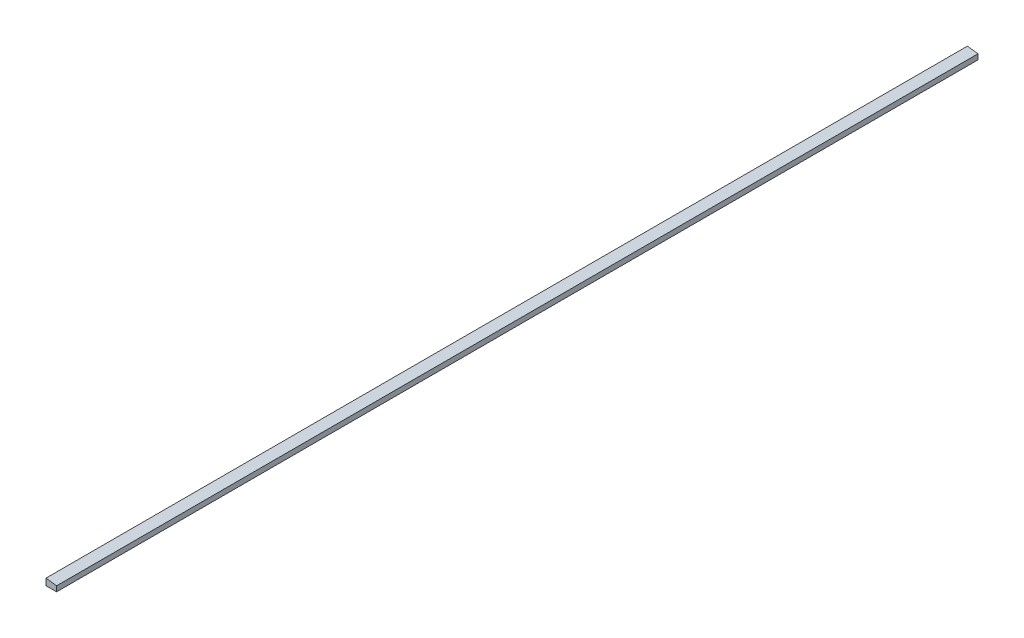
ISO-10303-21;
HEADER;
FILE_DESCRIPTION(('STEP AP214'),'2;1');
FILE_NAME('part.step','',(''),(''),'','','');
FILE_SCHEMA(('AUTOMOTIVE_DESIGN { 1 0 10303 214 1 1 1 1 }'));
ENDSEC;
DATA;
#1=APPLICATION_CONTEXT('core data for automotive mechanical design processes');
#2=APPLICATION_PROTOCOL_DEFINITION('international standard','automotive_design',2000,#1);
#3=PRODUCT_CONTEXT('',#1,'mechanical');
#4=PRODUCT('Part','Part','',(#3));
#5=PRODUCT_RELATED_PRODUCT_CATEGORY('part','',(#4));
#6=PRODUCT_DEFINITION_FORMATION('','',#4);
#7=PRODUCT_DEFINITION_CONTEXT('part definition',#1,'design');
#8=PRODUCT_DEFINITION('design','',#6,#7);
#9=PRODUCT_DEFINITION_SHAPE('','',#8);
#10=(LENGTH_UNIT() NAMED_UNIT(*) SI_UNIT(.MILLI.,.METRE.));
#11=(NAMED_UNIT(*) PLANE_ANGLE_UNIT() SI_UNIT($,.RADIAN.));
#12=(NAMED_UNIT(*) SI_UNIT($,.STERADIAN.) SOLID_ANGLE_UNIT());
#13=UNCERTAINTY_MEASURE_WITH_UNIT(LENGTH_MEASURE(1.E-05),#10,'distance_accuracy_value','');
#14=(GEOMETRIC_REPRESENTATION_CONTEXT(3) GLOBAL_UNCERTAINTY_ASSIGNED_CONTEXT((#13)) GLOBAL_UNIT_ASSIGNED_CONTEXT((#10,
#11,#12)) REPRESENTATION_CONTEXT('',''));
#15=CARTESIAN_POINT('',(0.,0.,0.));
#16=DIRECTION('',(0.,0.,1.));
#17=DIRECTION('',(1.,0.,0.));
#18=AXIS2_PLACEMENT_3D('',#15,#16,#17);
#19=CARTESIAN_POINT('',(0.,0.,695.));
#20=DIRECTION('',(1.,0.,0.));
#21=DIRECTION('',(0.,0.,-1.));
#22=AXIS2_PLACEMENT_3D('',#19,#20,#21);
#23=PLANE('',#22);
#24=DIRECTION('',(0.,-1.,0.));
#25=VECTOR('',#24,1.);
#26=CARTESIAN_POINT('',(0.,0.,0.));
#27=LINE('',#26,#25);
#28=CARTESIAN_POINT('',(0.,5.,0.));
#29=VERTEX_POINT('',#28);
#30=CARTESIAN_POINT('',(0.,0.,0.));
#31=VERTEX_POINT('',#30);
#32=EDGE_CURVE('E84',#29,#31,#27,.T.);
#33=ORIENTED_EDGE('',*,*,#32,.T.);
#34=DIRECTION('',(0.,0.,-1.));
#35=VECTOR('',#34,1.);
#36=CARTESIAN_POINT('',(0.,0.,695.));
#37=LINE('',#36,#35);
#38=CARTESIAN_POINT('',(0.,0.,695.));
#39=VERTEX_POINT('',#38);
#40=EDGE_CURVE('E11',#39,#31,#37,.T.);
#41=ORIENTED_EDGE('',*,*,#40,.F.);
#42=DIRECTION('',(0.,-1.,0.));
#43=VECTOR('',#42,1.);
#44=CARTESIAN_POINT('',(0.,0.,695.));
#45=LINE('',#44,#43);
#46=CARTESIAN_POINT('',(0.,5.,695.));
#47=VERTEX_POINT('',#46);
#48=EDGE_CURVE('E95',#47,#39,#45,.T.);
#49=ORIENTED_EDGE('',*,*,#48,.F.);
#50=DIRECTION('',(0.,0.,-1.));
#51=VECTOR('',#50,1.);
#52=CARTESIAN_POINT('',(0.,5.,695.));
#53=LINE('',#52,#51);
#54=EDGE_CURVE('E91',#47,#29,#53,.T.);
#55=ORIENTED_EDGE('',*,*,#54,.T.);
#56=EDGE_LOOP('',(#33,#41,#49,#55));
#57=FACE_BOUND('',#56,.T.);
#58=ADVANCED_FACE('F38',(#57),#23,.F.);
#59=CARTESIAN_POINT('',(0.,0.,695.));
#60=DIRECTION('',(0.,1.,0.));
#61=DIRECTION('',(0.,0.,1.));
#62=AXIS2_PLACEMENT_3D('',#59,#60,#61);
#63=PLANE('',#62);
#64=DIRECTION('',(1.,0.,0.));
#65=VECTOR('',#64,1.);
#66=CARTESIAN_POINT('',(0.,0.,0.));
#67=LINE('',#66,#65);
#68=CARTESIAN_POINT('',(8.,0.,0.));
#69=VERTEX_POINT('',#68);
#70=EDGE_CURVE('E73',#31,#69,#67,.T.);
#71=ORIENTED_EDGE('',*,*,#70,.T.);
#72=DIRECTION('',(0.,0.,-1.));
#73=VECTOR('',#72,1.);
#74=CARTESIAN_POINT('',(8.,0.,695.));
#75=LINE('',#74,#73);
#76=CARTESIAN_POINT('',(8.,0.,695.));
#77=VERTEX_POINT('',#76);
#78=EDGE_CURVE('E46',#77,#69,#75,.T.);
#79=ORIENTED_EDGE('',*,*,#78,.F.);
#80=DIRECTION('',(1.,0.,0.));
#81=VECTOR('',#80,1.);
#82=CARTESIAN_POINT('',(0.,0.,695.));
#83=LINE('',#82,#81);
#84=EDGE_CURVE('E62',#39,#77,#83,.T.);
#85=ORIENTED_EDGE('',*,*,#84,.F.);
#86=ORIENTED_EDGE('',*,*,#40,.T.);
#87=EDGE_LOOP('',(#71,#79,#85,#86));
#88=FACE_BOUND('',#87,.T.);
#89=ADVANCED_FACE('F75',(#88),#63,.F.);
#90=CARTESIAN_POINT('',(8.,0.,695.));
#91=DIRECTION('',(-1.,0.,0.));
#92=DIRECTION('',(0.,0.,1.));
#93=AXIS2_PLACEMENT_3D('',#90,#91,#92);
#94=PLANE('',#93);
#95=DIRECTION('',(0.,1.,0.));
#96=VECTOR('',#95,1.);
#97=CARTESIAN_POINT('',(8.,0.,0.));
#98=LINE('',#97,#96);
#99=CARTESIAN_POINT('',(8.,4.,0.));
#100=VERTEX_POINT('',#99);
#101=EDGE_CURVE('E83',#69,#100,#98,.T.);
#102=ORIENTED_EDGE('',*,*,#101,.T.);
#103=DIRECTION('',(0.,0.,1.));
#104=VECTOR('',#103,1.);
#105=CARTESIAN_POINT('',(8.,4.,0.));
#106=LINE('',#105,#104);
#107=CARTESIAN_POINT('',(8.,4.,695.));
#108=VERTEX_POINT('',#107);
#109=EDGE_CURVE('E53',#100,#108,#106,.T.);
#110=ORIENTED_EDGE('',*,*,#109,.T.);
#111=DIRECTION('',(0.,1.,0.));
#112=VECTOR('',#111,1.);
#113=CARTESIAN_POINT('',(8.,0.,695.));
#114=LINE('',#113,#112);
#115=EDGE_CURVE('E89',#77,#108,#114,.T.);
#116=ORIENTED_EDGE('',*,*,#115,.F.);
#117=ORIENTED_EDGE('',*,*,#78,.T.);
#118=EDGE_LOOP('',(#102,#110,#116,#117));
#119=FACE_BOUND('',#118,.T.);
#120=ADVANCED_FACE('F88',(#119),#94,.F.);
#121=CARTESIAN_POINT('',(0.,0.,695.));
#122=DIRECTION('',(0.,0.,-1.));
#123=DIRECTION('',(-1.,0.,0.));
#124=AXIS2_PLACEMENT_3D('',#121,#122,#123);
#125=PLANE('',#124);
#126=ORIENTED_EDGE('',*,*,#115,.T.);
#127=DIRECTION('',(0.992277876713668,-0.124034734589208,0.));
#128=VECTOR('',#127,1.);
#129=CARTESIAN_POINT('',(0.,5.,695.));
#130=LINE('',#129,#128);
#131=EDGE_CURVE('E116',#47,#108,#130,.T.);
#132=ORIENTED_EDGE('',*,*,#131,.F.);
#133=ORIENTED_EDGE('',*,*,#48,.T.);
#134=ORIENTED_EDGE('',*,*,#84,.T.);
#135=EDGE_LOOP('',(#126,#132,#133,#134));
#136=FACE_BOUND('',#135,.T.);
#137=ADVANCED_FACE('F122',(#136),#125,.F.);
#138=CARTESIAN_POINT('',(0.,0.,0.));
#139=DIRECTION('',(0.,0.,-1.));
#140=DIRECTION('',(-1.,0.,0.));
#141=AXIS2_PLACEMENT_3D('',#138,#139,#140);
#142=PLANE('',#141);
#143=DIRECTION('',(0.992277876713668,-0.124034734589208,0.));
#144=VECTOR('',#143,1.);
#145=CARTESIAN_POINT('',(0.,5.,0.));
#146=LINE('',#145,#144);
#147=EDGE_CURVE('E93',#29,#100,#146,.T.);
#148=ORIENTED_EDGE('',*,*,#147,.T.);
#149=ORIENTED_EDGE('',*,*,#101,.F.);
#150=ORIENTED_EDGE('',*,*,#70,.F.);
#151=ORIENTED_EDGE('',*,*,#32,.F.);
#152=EDGE_LOOP('',(#148,#149,#150,#151));
#153=FACE_BOUND('',#152,.T.);
#154=ADVANCED_FACE('F92',(#153),#142,.T.);
#155=CARTESIAN_POINT('',(0.,5.,0.));
#156=DIRECTION('',(-0.124034734589208,-0.992277876713668,0.));
#157=DIRECTION('',(0.992277876713668,-0.124034734589208,0.));
#158=AXIS2_PLACEMENT_3D('',#155,#156,#157);
#159=PLANE('',#158);
#160=ORIENTED_EDGE('',*,*,#131,.T.);
#161=ORIENTED_EDGE('',*,*,#109,.F.);
#162=ORIENTED_EDGE('',*,*,#147,.F.);
#163=ORIENTED_EDGE('',*,*,#54,.F.);
#164=EDGE_LOOP('',(#160,#161,#162,#163));
#165=FACE_BOUND('',#164,.T.);
#166=ADVANCED_FACE('F120',(#165),#159,.F.);
#167=CLOSED_SHELL('',(#58,#89,#120,#137,#154,#166));
#168=MANIFOLD_SOLID_BREP('B2',#167);
#169=ADVANCED_BREP_SHAPE_REPRESENTATION('',(#18,#168),#14);
#170=SHAPE_DEFINITION_REPRESENTATION(#9,#169);
ENDSEC;
END-ISO-10303-21;
